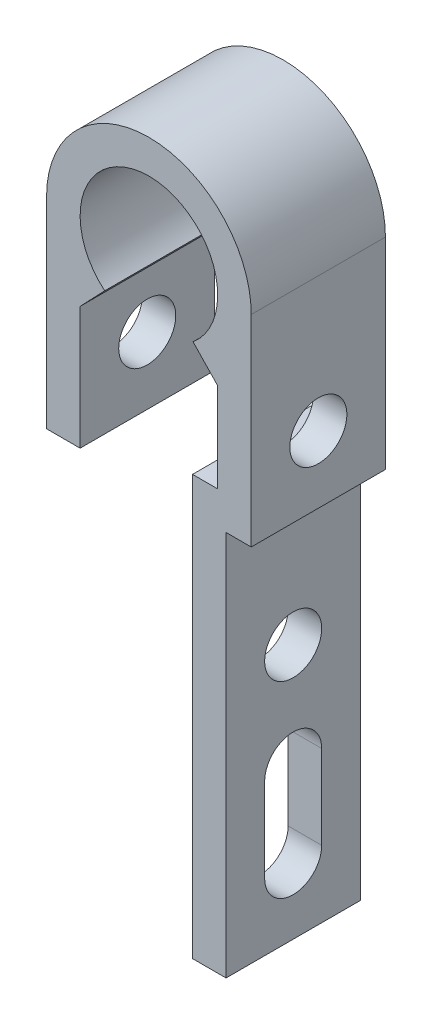
ISO-10303-21;
HEADER;
FILE_DESCRIPTION(('STEP AP214'),'2;1');
FILE_NAME('part.step','',(''),(''),'','','');
FILE_SCHEMA(('AUTOMOTIVE_DESIGN { 1 0 10303 214 1 1 1 1 }'));
ENDSEC;
DATA;
#1=APPLICATION_CONTEXT('core data for automotive mechanical design processes');
#2=APPLICATION_PROTOCOL_DEFINITION('international standard','automotive_design',2000,#1);
#3=PRODUCT_CONTEXT('',#1,'mechanical');
#4=PRODUCT('Part','Part','',(#3));
#5=PRODUCT_RELATED_PRODUCT_CATEGORY('part','',(#4));
#6=PRODUCT_DEFINITION_FORMATION('','',#4);
#7=PRODUCT_DEFINITION_CONTEXT('part definition',#1,'design');
#8=PRODUCT_DEFINITION('design','',#6,#7);
#9=PRODUCT_DEFINITION_SHAPE('','',#8);
#10=(LENGTH_UNIT() NAMED_UNIT(*) SI_UNIT(.MILLI.,.METRE.));
#11=(NAMED_UNIT(*) PLANE_ANGLE_UNIT() SI_UNIT($,.RADIAN.));
#12=(NAMED_UNIT(*) SI_UNIT($,.STERADIAN.) SOLID_ANGLE_UNIT());
#13=UNCERTAINTY_MEASURE_WITH_UNIT(LENGTH_MEASURE(1.E-05),#10,'distance_accuracy_value','');
#14=(GEOMETRIC_REPRESENTATION_CONTEXT(3) GLOBAL_UNCERTAINTY_ASSIGNED_CONTEXT((#13)) GLOBAL_UNIT_ASSIGNED_CONTEXT((#10,
#11,#12)) REPRESENTATION_CONTEXT('',''));
#15=CARTESIAN_POINT('',(0.,0.,0.));
#16=DIRECTION('',(0.,0.,1.));
#17=DIRECTION('',(1.,0.,0.));
#18=AXIS2_PLACEMENT_3D('',#15,#16,#17);
#19=CARTESIAN_POINT('',(-4.1,-12.,8.));
#20=DIRECTION('',(-1.,0.,0.));
#21=DIRECTION('',(0.,0.,1.));
#22=AXIS2_PLACEMENT_3D('',#19,#20,#21);
#23=PLANE('',#22);
#24=CARTESIAN_POINT('',(-4.1,-8.,4.));
#25=DIRECTION('',(-1.,0.,0.));
#26=DIRECTION('',(0.,0.,1.));
#27=AXIS2_PLACEMENT_3D('',#24,#25,#26);
#28=CIRCLE('',#27,1.7);
#29=CARTESIAN_POINT('',(-4.1,-8.,5.7));
#30=VERTEX_POINT('',#29);
#31=EDGE_CURVE('E250',#30,#30,#28,.T.);
#32=ORIENTED_EDGE('',*,*,#31,.T.);
#33=EDGE_LOOP('',(#32));
#34=FACE_BOUND('',#33,.T.);
#35=DIRECTION('',(0.,1.,0.));
#36=VECTOR('',#35,1.);
#37=CARTESIAN_POINT('',(-4.1,-12.,0.));
#38=LINE('',#37,#36);
#39=CARTESIAN_POINT('',(-4.1,-12.,0.));
#40=VERTEX_POINT('',#39);
#41=CARTESIAN_POINT('',(-4.1,-4.67694508196814,0.));
#42=VERTEX_POINT('',#41);
#43=EDGE_CURVE('E247',#40,#42,#38,.T.);
#44=ORIENTED_EDGE('',*,*,#43,.T.);
#45=DIRECTION('',(0.,0.,-1.));
#46=VECTOR('',#45,1.);
#47=CARTESIAN_POINT('',(-4.1,-4.67694508196814,8.));
#48=LINE('',#47,#46);
#49=CARTESIAN_POINT('',(-4.1,-4.67694508196814,8.));
#50=VERTEX_POINT('',#49);
#51=EDGE_CURVE('E159',#50,#42,#48,.T.);
#52=ORIENTED_EDGE('',*,*,#51,.F.);
#53=DIRECTION('',(0.,1.,0.));
#54=VECTOR('',#53,1.);
#55=CARTESIAN_POINT('',(-4.1,-12.,8.));
#56=LINE('',#55,#54);
#57=CARTESIAN_POINT('',(-4.1,-12.,8.));
#58=VERTEX_POINT('',#57);
#59=EDGE_CURVE('E222',#58,#50,#56,.T.);
#60=ORIENTED_EDGE('',*,*,#59,.F.);
#61=DIRECTION('',(0.,0.,-1.));
#62=VECTOR('',#61,1.);
#63=CARTESIAN_POINT('',(-4.1,-12.,8.));
#64=LINE('',#63,#62);
#65=EDGE_CURVE('E216',#58,#40,#64,.T.);
#66=ORIENTED_EDGE('',*,*,#65,.T.);
#67=EDGE_LOOP('',(#44,#52,#60,#66));
#68=FACE_BOUND('',#67,.T.);
#69=ADVANCED_FACE('F32',(#34,#68),#23,.F.);
#70=CARTESIAN_POINT('',(-2.63542919971482,-3.14078221678781,8.));
#71=DIRECTION('',(-0.723771106305428,0.690040133381687,0.));
#72=DIRECTION('',(-0.690040133381687,-0.723771106305428,0.));
#73=AXIS2_PLACEMENT_3D('',#70,#71,#72);
#74=PLANE('',#73);
#75=DIRECTION('',(0.690040133381687,0.723771106305428,0.));
#76=VECTOR('',#75,1.);
#77=CARTESIAN_POINT('',(-2.63542919971482,-3.14078221678781,0.));
#78=LINE('',#77,#76);
#79=CARTESIAN_POINT('',(-2.63542919971481,-3.14078221678781,0.));
#80=VERTEX_POINT('',#79);
#81=EDGE_CURVE('E245',#42,#80,#78,.T.);
#82=ORIENTED_EDGE('',*,*,#81,.T.);
#83=DIRECTION('',(0.,0.,-1.));
#84=VECTOR('',#83,1.);
#85=CARTESIAN_POINT('',(-2.63542919971481,-3.14078221678781,8.));
#86=LINE('',#85,#84);
#87=CARTESIAN_POINT('',(-2.63542919971481,-3.14078221678781,8.));
#88=VERTEX_POINT('',#87);
#89=EDGE_CURVE('E180',#88,#80,#86,.T.);
#90=ORIENTED_EDGE('',*,*,#89,.F.);
#91=DIRECTION('',(0.690040133381687,0.723771106305428,0.));
#92=VECTOR('',#91,1.);
#93=CARTESIAN_POINT('',(-2.63542919971482,-3.14078221678781,8.));
#94=LINE('',#93,#92);
#95=EDGE_CURVE('E274',#50,#88,#94,.T.);
#96=ORIENTED_EDGE('',*,*,#95,.F.);
#97=ORIENTED_EDGE('',*,*,#51,.T.);
#98=EDGE_LOOP('',(#82,#90,#96,#97));
#99=FACE_BOUND('',#98,.T.);
#100=ADVANCED_FACE('F322',(#99),#74,.F.);
#101=CARTESIAN_POINT('',(0.,0.,8.));
#102=DIRECTION('',(0.,0.,-1.));
#103=DIRECTION('',(-1.,0.,0.));
#104=AXIS2_PLACEMENT_3D('',#101,#102,#103);
#105=CYLINDRICAL_SURFACE('',#104,4.1);
#106=CARTESIAN_POINT('',(0.,0.,0.));
#107=DIRECTION('',(0.,0.,-1.));
#108=DIRECTION('',(-1.,0.,0.));
#109=AXIS2_PLACEMENT_3D('',#106,#107,#108);
#110=CIRCLE('',#109,4.1);
#111=CARTESIAN_POINT('',(2.63542919971482,-3.14078221678781,0.));
#112=VERTEX_POINT('',#111);
#113=EDGE_CURVE('E243',#80,#112,#110,.T.);
#114=ORIENTED_EDGE('',*,*,#113,.T.);
#115=DIRECTION('',(0.,0.,-1.));
#116=VECTOR('',#115,1.);
#117=CARTESIAN_POINT('',(2.63542919971482,-3.14078221678781,8.));
#118=LINE('',#117,#116);
#119=CARTESIAN_POINT('',(2.63542919971482,-3.14078221678781,8.));
#120=VERTEX_POINT('',#119);
#121=EDGE_CURVE('E183',#120,#112,#118,.T.);
#122=ORIENTED_EDGE('',*,*,#121,.F.);
#123=CARTESIAN_POINT('',(0.,0.,8.));
#124=DIRECTION('',(0.,0.,-1.));
#125=DIRECTION('',(-1.,0.,0.));
#126=AXIS2_PLACEMENT_3D('',#123,#124,#125);
#127=CIRCLE('',#126,4.1);
#128=EDGE_CURVE('E272',#88,#120,#127,.T.);
#129=ORIENTED_EDGE('',*,*,#128,.F.);
#130=ORIENTED_EDGE('',*,*,#89,.T.);
#131=EDGE_LOOP('',(#114,#122,#129,#130));
#132=FACE_BOUND('',#131,.T.);
#133=ADVANCED_FACE('F327',(#132),#105,.F.);
#134=CARTESIAN_POINT('',(4.1,-4.67694508196814,8.));
#135=DIRECTION('',(0.723771106305428,0.690040133381687,0.));
#136=DIRECTION('',(-0.690040133381688,0.723771106305428,0.));
#137=AXIS2_PLACEMENT_3D('',#134,#135,#136);
#138=PLANE('',#137);
#139=DIRECTION('',(0.690040133381687,-0.723771106305428,0.));
#140=VECTOR('',#139,1.);
#141=CARTESIAN_POINT('',(4.1,-4.67694508196814,0.));
#142=LINE('',#141,#140);
#143=CARTESIAN_POINT('',(4.1,-4.67694508196814,0.));
#144=VERTEX_POINT('',#143);
#145=EDGE_CURVE('E241',#112,#144,#142,.T.);
#146=ORIENTED_EDGE('',*,*,#145,.T.);
#147=DIRECTION('',(0.,0.,-1.));
#148=VECTOR('',#147,1.);
#149=CARTESIAN_POINT('',(4.1,-4.67694508196814,8.));
#150=LINE('',#149,#148);
#151=CARTESIAN_POINT('',(4.1,-4.67694508196814,8.));
#152=VERTEX_POINT('',#151);
#153=EDGE_CURVE('E186',#152,#144,#150,.T.);
#154=ORIENTED_EDGE('',*,*,#153,.F.);
#155=DIRECTION('',(0.690040133381687,-0.723771106305428,0.));
#156=VECTOR('',#155,1.);
#157=CARTESIAN_POINT('',(4.1,-4.67694508196814,8.));
#158=LINE('',#157,#156);
#159=EDGE_CURVE('E270',#120,#152,#158,.T.);
#160=ORIENTED_EDGE('',*,*,#159,.F.);
#161=ORIENTED_EDGE('',*,*,#121,.T.);
#162=EDGE_LOOP('',(#146,#154,#160,#161));
#163=FACE_BOUND('',#162,.T.);
#164=ADVANCED_FACE('F391',(#163),#138,.F.);
#165=CARTESIAN_POINT('',(4.1,-4.67694508196814,8.));
#166=DIRECTION('',(1.,0.,0.));
#167=DIRECTION('',(0.,1.,0.));
#168=AXIS2_PLACEMENT_3D('',#165,#166,#167);
#169=PLANE('',#168);
#170=CARTESIAN_POINT('',(4.1,-8.,4.));
#171=DIRECTION('',(1.,0.,0.));
#172=DIRECTION('',(0.,1.,0.));
#173=AXIS2_PLACEMENT_3D('',#170,#171,#172);
#174=CIRCLE('',#173,1.7);
#175=CARTESIAN_POINT('',(4.1,-6.3,4.));
#176=VERTEX_POINT('',#175);
#177=EDGE_CURVE('E280',#176,#176,#174,.T.);
#178=ORIENTED_EDGE('',*,*,#177,.T.);
#179=EDGE_LOOP('',(#178));
#180=FACE_BOUND('',#179,.T.);
#181=DIRECTION('',(0.,-1.,0.));
#182=VECTOR('',#181,1.);
#183=CARTESIAN_POINT('',(4.1,-4.67694508196814,0.));
#184=LINE('',#183,#182);
#185=CARTESIAN_POINT('',(4.1,-10.,0.));
#186=VERTEX_POINT('',#185);
#187=EDGE_CURVE('E239',#144,#186,#184,.T.);
#188=ORIENTED_EDGE('',*,*,#187,.T.);
#189=DIRECTION('',(0.,0.,-1.));
#190=VECTOR('',#189,1.);
#191=CARTESIAN_POINT('',(4.1,-10.,8.));
#192=LINE('',#191,#190);
#193=CARTESIAN_POINT('',(4.1,-10.,8.));
#194=VERTEX_POINT('',#193);
#195=EDGE_CURVE('E189',#194,#186,#192,.T.);
#196=ORIENTED_EDGE('',*,*,#195,.F.);
#197=DIRECTION('',(0.,-1.,0.));
#198=VECTOR('',#197,1.);
#199=CARTESIAN_POINT('',(4.1,-4.67694508196814,8.));
#200=LINE('',#199,#198);
#201=EDGE_CURVE('E268',#152,#194,#200,.T.);
#202=ORIENTED_EDGE('',*,*,#201,.F.);
#203=ORIENTED_EDGE('',*,*,#153,.T.);
#204=EDGE_LOOP('',(#188,#196,#202,#203));
#205=FACE_BOUND('',#204,.T.);
#206=ADVANCED_FACE('F387',(#180,#205),#169,.F.);
#207=CARTESIAN_POINT('',(4.1,-10.,8.));
#208=DIRECTION('',(0.,-1.,0.));
#209=DIRECTION('',(0.,0.,-1.));
#210=AXIS2_PLACEMENT_3D('',#207,#208,#209);
#211=PLANE('',#210);
#212=DIRECTION('',(-1.,0.,0.));
#213=VECTOR('',#212,1.);
#214=CARTESIAN_POINT('',(4.1,-10.,0.));
#215=LINE('',#214,#213);
#216=CARTESIAN_POINT('',(2.6,-10.,0.));
#217=VERTEX_POINT('',#216);
#218=EDGE_CURVE('E237',#186,#217,#215,.T.);
#219=ORIENTED_EDGE('',*,*,#218,.T.);
#220=DIRECTION('',(0.,0.,-1.));
#221=VECTOR('',#220,1.);
#222=CARTESIAN_POINT('',(2.6,-10.,8.));
#223=LINE('',#222,#221);
#224=CARTESIAN_POINT('',(2.6,-10.,8.));
#225=VERTEX_POINT('',#224);
#226=EDGE_CURVE('E192',#225,#217,#223,.T.);
#227=ORIENTED_EDGE('',*,*,#226,.F.);
#228=DIRECTION('',(-1.,0.,0.));
#229=VECTOR('',#228,1.);
#230=CARTESIAN_POINT('',(4.1,-10.,8.));
#231=LINE('',#230,#229);
#232=EDGE_CURVE('E266',#194,#225,#231,.T.);
#233=ORIENTED_EDGE('',*,*,#232,.F.);
#234=ORIENTED_EDGE('',*,*,#195,.T.);
#235=EDGE_LOOP('',(#219,#227,#233,#234));
#236=FACE_BOUND('',#235,.T.);
#237=ADVANCED_FACE('F382',(#236),#211,.F.);
#238=CARTESIAN_POINT('',(2.6,-10.,8.));
#239=DIRECTION('',(1.,0.,0.));
#240=DIRECTION('',(0.,1.,0.));
#241=AXIS2_PLACEMENT_3D('',#238,#239,#240);
#242=PLANE('',#241);
#243=CARTESIAN_POINT('',(2.6,-19.8,4.));
#244=DIRECTION('',(1.,0.,0.));
#245=DIRECTION('',(0.,1.,0.));
#246=AXIS2_PLACEMENT_3D('',#243,#244,#245);
#247=CIRCLE('',#246,1.7);
#248=CARTESIAN_POINT('',(2.6,-18.1,4.));
#249=VERTEX_POINT('',#248);
#250=EDGE_CURVE('E287',#249,#249,#247,.T.);
#251=ORIENTED_EDGE('',*,*,#250,.T.);
#252=EDGE_LOOP('',(#251));
#253=FACE_BOUND('',#252,.T.);
#254=DIRECTION('',(0.,1.,0.));
#255=VECTOR('',#254,1.);
#256=CARTESIAN_POINT('',(2.6,-10.,2.3));
#257=LINE('',#256,#255);
#258=CARTESIAN_POINT('',(2.6,-31.,2.3));
#259=VERTEX_POINT('',#258);
#260=CARTESIAN_POINT('',(2.6,-26.,2.3));
#261=VERTEX_POINT('',#260);
#262=EDGE_CURVE('E299',#259,#261,#257,.T.);
#263=ORIENTED_EDGE('',*,*,#262,.T.);
#264=CARTESIAN_POINT('',(2.6,-26.,4.));
#265=DIRECTION('',(1.,0.,0.));
#266=DIRECTION('',(0.,1.,0.));
#267=AXIS2_PLACEMENT_3D('',#264,#265,#266);
#268=CIRCLE('',#267,1.7);
#269=CARTESIAN_POINT('',(2.6,-26.,5.7));
#270=VERTEX_POINT('',#269);
#271=EDGE_CURVE('E166',#261,#270,#268,.T.);
#272=ORIENTED_EDGE('',*,*,#271,.T.);
#273=DIRECTION('',(0.,-1.,0.));
#274=VECTOR('',#273,1.);
#275=CARTESIAN_POINT('',(2.6,-10.,5.69999999999999));
#276=LINE('',#275,#274);
#277=CARTESIAN_POINT('',(2.6,-31.,5.7));
#278=VERTEX_POINT('',#277);
#279=EDGE_CURVE('E293',#270,#278,#276,.T.);
#280=ORIENTED_EDGE('',*,*,#279,.T.);
#281=CARTESIAN_POINT('',(2.6,-31.,4.));
#282=DIRECTION('',(1.,0.,0.));
#283=DIRECTION('',(0.,1.,0.));
#284=AXIS2_PLACEMENT_3D('',#281,#282,#283);
#285=CIRCLE('',#284,1.7);
#286=EDGE_CURVE('E296',#278,#259,#285,.T.);
#287=ORIENTED_EDGE('',*,*,#286,.T.);
#288=EDGE_LOOP('',(#263,#272,#280,#287));
#289=FACE_BOUND('',#288,.T.);
#290=DIRECTION('',(0.,-1.,0.));
#291=VECTOR('',#290,1.);
#292=CARTESIAN_POINT('',(2.6,-10.,0.));
#293=LINE('',#292,#291);
#294=CARTESIAN_POINT('',(2.6,-35.,0.));
#295=VERTEX_POINT('',#294);
#296=EDGE_CURVE('E235',#217,#295,#293,.T.);
#297=ORIENTED_EDGE('',*,*,#296,.T.);
#298=DIRECTION('',(0.,0.,-1.));
#299=VECTOR('',#298,1.);
#300=CARTESIAN_POINT('',(2.6,-35.,8.));
#301=LINE('',#300,#299);
#302=CARTESIAN_POINT('',(2.6,-35.,8.));
#303=VERTEX_POINT('',#302);
#304=EDGE_CURVE('E195',#303,#295,#301,.T.);
#305=ORIENTED_EDGE('',*,*,#304,.F.);
#306=DIRECTION('',(0.,-1.,0.));
#307=VECTOR('',#306,1.);
#308=CARTESIAN_POINT('',(2.6,-10.,8.));
#309=LINE('',#308,#307);
#310=EDGE_CURVE('E264',#225,#303,#309,.T.);
#311=ORIENTED_EDGE('',*,*,#310,.F.);
#312=ORIENTED_EDGE('',*,*,#226,.T.);
#313=EDGE_LOOP('',(#297,#305,#311,#312));
#314=FACE_BOUND('',#313,.T.);
#315=ADVANCED_FACE('F306',(#253,#289,#314),#242,.F.);
#316=CARTESIAN_POINT('',(2.6,-35.,8.));
#317=DIRECTION('',(0.,1.,0.));
#318=DIRECTION('',(0.,0.,1.));
#319=AXIS2_PLACEMENT_3D('',#316,#317,#318);
#320=PLANE('',#319);
#321=DIRECTION('',(1.,0.,0.));
#322=VECTOR('',#321,1.);
#323=CARTESIAN_POINT('',(2.6,-35.,0.));
#324=LINE('',#323,#322);
#325=CARTESIAN_POINT('',(4.6,-35.,0.));
#326=VERTEX_POINT('',#325);
#327=EDGE_CURVE('E233',#295,#326,#324,.T.);
#328=ORIENTED_EDGE('',*,*,#327,.T.);
#329=DIRECTION('',(0.,0.,-1.));
#330=VECTOR('',#329,1.);
#331=CARTESIAN_POINT('',(4.6,-35.,8.));
#332=LINE('',#331,#330);
#333=CARTESIAN_POINT('',(4.6,-35.,8.));
#334=VERTEX_POINT('',#333);
#335=EDGE_CURVE('E198',#334,#326,#332,.T.);
#336=ORIENTED_EDGE('',*,*,#335,.F.);
#337=DIRECTION('',(1.,0.,0.));
#338=VECTOR('',#337,1.);
#339=CARTESIAN_POINT('',(2.6,-35.,8.));
#340=LINE('',#339,#338);
#341=EDGE_CURVE('E262',#303,#334,#340,.T.);
#342=ORIENTED_EDGE('',*,*,#341,.F.);
#343=ORIENTED_EDGE('',*,*,#304,.T.);
#344=EDGE_LOOP('',(#328,#336,#342,#343));
#345=FACE_BOUND('',#344,.T.);
#346=ADVANCED_FACE('F375',(#345),#320,.F.);
#347=CARTESIAN_POINT('',(4.6,-12.,8.));
#348=DIRECTION('',(-1.,0.,0.));
#349=DIRECTION('',(0.,-1.,0.));
#350=AXIS2_PLACEMENT_3D('',#347,#348,#349);
#351=PLANE('',#350);
#352=CARTESIAN_POINT('',(4.6,-19.8,4.));
#353=DIRECTION('',(-1.,0.,0.));
#354=DIRECTION('',(0.,-1.,0.));
#355=AXIS2_PLACEMENT_3D('',#352,#353,#354);
#356=CIRCLE('',#355,1.7);
#357=CARTESIAN_POINT('',(4.6,-21.5,4.));
#358=VERTEX_POINT('',#357);
#359=EDGE_CURVE('E35',#358,#358,#356,.T.);
#360=ORIENTED_EDGE('',*,*,#359,.T.);
#361=EDGE_LOOP('',(#360));
#362=FACE_BOUND('',#361,.T.);
#363=DIRECTION('',(0.,1.,0.));
#364=VECTOR('',#363,1.);
#365=CARTESIAN_POINT('',(4.6,-12.,5.69999999999999));
#366=LINE('',#365,#364);
#367=CARTESIAN_POINT('',(4.6,-31.,5.7));
#368=VERTEX_POINT('',#367);
#369=CARTESIAN_POINT('',(4.6,-26.,5.7));
#370=VERTEX_POINT('',#369);
#371=EDGE_CURVE('E40',#368,#370,#366,.T.);
#372=ORIENTED_EDGE('',*,*,#371,.T.);
#373=CARTESIAN_POINT('',(4.6,-26.,4.));
#374=DIRECTION('',(-1.,0.,0.));
#375=DIRECTION('',(0.,-1.,0.));
#376=AXIS2_PLACEMENT_3D('',#373,#374,#375);
#377=CIRCLE('',#376,1.7);
#378=CARTESIAN_POINT('',(4.6,-26.,2.3));
#379=VERTEX_POINT('',#378);
#380=EDGE_CURVE('E11',#370,#379,#377,.T.);
#381=ORIENTED_EDGE('',*,*,#380,.T.);
#382=DIRECTION('',(0.,-1.,0.));
#383=VECTOR('',#382,1.);
#384=CARTESIAN_POINT('',(4.6,-12.,2.3));
#385=LINE('',#384,#383);
#386=CARTESIAN_POINT('',(4.6,-31.,2.3));
#387=VERTEX_POINT('',#386);
#388=EDGE_CURVE('E154',#379,#387,#385,.T.);
#389=ORIENTED_EDGE('',*,*,#388,.T.);
#390=CARTESIAN_POINT('',(4.6,-31.,4.));
#391=DIRECTION('',(-1.,0.,0.));
#392=DIRECTION('',(0.,-1.,0.));
#393=AXIS2_PLACEMENT_3D('',#390,#391,#392);
#394=CIRCLE('',#393,1.7);
#395=EDGE_CURVE('E158',#387,#368,#394,.T.);
#396=ORIENTED_EDGE('',*,*,#395,.T.);
#397=EDGE_LOOP('',(#372,#381,#389,#396));
#398=FACE_BOUND('',#397,.T.);
#399=DIRECTION('',(0.,1.,0.));
#400=VECTOR('',#399,1.);
#401=CARTESIAN_POINT('',(4.6,-12.,0.));
#402=LINE('',#401,#400);
#403=CARTESIAN_POINT('',(4.6,-12.,0.));
#404=VERTEX_POINT('',#403);
#405=EDGE_CURVE('E231',#326,#404,#402,.T.);
#406=ORIENTED_EDGE('',*,*,#405,.T.);
#407=DIRECTION('',(0.,0.,-1.));
#408=VECTOR('',#407,1.);
#409=CARTESIAN_POINT('',(4.6,-12.,8.));
#410=LINE('',#409,#408);
#411=CARTESIAN_POINT('',(4.6,-12.,8.));
#412=VERTEX_POINT('',#411);
#413=EDGE_CURVE('E201',#412,#404,#410,.T.);
#414=ORIENTED_EDGE('',*,*,#413,.F.);
#415=DIRECTION('',(0.,1.,0.));
#416=VECTOR('',#415,1.);
#417=CARTESIAN_POINT('',(4.6,-12.,8.));
#418=LINE('',#417,#416);
#419=EDGE_CURVE('E260',#334,#412,#418,.T.);
#420=ORIENTED_EDGE('',*,*,#419,.F.);
#421=ORIENTED_EDGE('',*,*,#335,.T.);
#422=EDGE_LOOP('',(#406,#414,#420,#421));
#423=FACE_BOUND('',#422,.T.);
#424=ADVANCED_FACE('F170',(#362,#398,#423),#351,.F.);
#425=CARTESIAN_POINT('',(6.1,-12.,8.));
#426=DIRECTION('',(0.,1.,0.));
#427=DIRECTION('',(0.,0.,1.));
#428=AXIS2_PLACEMENT_3D('',#425,#426,#427);
#429=PLANE('',#428);
#430=DIRECTION('',(1.,0.,0.));
#431=VECTOR('',#430,1.);
#432=CARTESIAN_POINT('',(6.1,-12.,0.));
#433=LINE('',#432,#431);
#434=CARTESIAN_POINT('',(6.1,-12.,0.));
#435=VERTEX_POINT('',#434);
#436=EDGE_CURVE('E229',#404,#435,#433,.T.);
#437=ORIENTED_EDGE('',*,*,#436,.T.);
#438=DIRECTION('',(0.,0.,-1.));
#439=VECTOR('',#438,1.);
#440=CARTESIAN_POINT('',(6.1,-12.,8.));
#441=LINE('',#440,#439);
#442=CARTESIAN_POINT('',(6.1,-12.,8.));
#443=VERTEX_POINT('',#442);
#444=EDGE_CURVE('E204',#443,#435,#441,.T.);
#445=ORIENTED_EDGE('',*,*,#444,.F.);
#446=DIRECTION('',(1.,0.,0.));
#447=VECTOR('',#446,1.);
#448=CARTESIAN_POINT('',(6.1,-12.,8.));
#449=LINE('',#448,#447);
#450=EDGE_CURVE('E258',#412,#443,#449,.T.);
#451=ORIENTED_EDGE('',*,*,#450,.F.);
#452=ORIENTED_EDGE('',*,*,#413,.T.);
#453=EDGE_LOOP('',(#437,#445,#451,#452));
#454=FACE_BOUND('',#453,.T.);
#455=ADVANCED_FACE('F366',(#454),#429,.F.);
#456=CARTESIAN_POINT('',(6.1,0.,8.));
#457=DIRECTION('',(-1.,0.,0.));
#458=DIRECTION('',(0.,0.,1.));
#459=AXIS2_PLACEMENT_3D('',#456,#457,#458);
#460=PLANE('',#459);
#461=CARTESIAN_POINT('',(6.1,-8.,4.));
#462=DIRECTION('',(-1.,0.,0.));
#463=DIRECTION('',(0.,0.,1.));
#464=AXIS2_PLACEMENT_3D('',#461,#462,#463);
#465=CIRCLE('',#464,1.7);
#466=CARTESIAN_POINT('',(6.1,-8.,5.7));
#467=VERTEX_POINT('',#466);
#468=EDGE_CURVE('E283',#467,#467,#465,.T.);
#469=ORIENTED_EDGE('',*,*,#468,.T.);
#470=EDGE_LOOP('',(#469));
#471=FACE_BOUND('',#470,.T.);
#472=DIRECTION('',(0.,1.,0.));
#473=VECTOR('',#472,1.);
#474=CARTESIAN_POINT('',(6.1,0.,0.));
#475=LINE('',#474,#473);
#476=CARTESIAN_POINT('',(6.1,0.,0.));
#477=VERTEX_POINT('',#476);
#478=EDGE_CURVE('E227',#435,#477,#475,.T.);
#479=ORIENTED_EDGE('',*,*,#478,.T.);
#480=DIRECTION('',(0.,0.,-1.));
#481=VECTOR('',#480,1.);
#482=CARTESIAN_POINT('',(6.1,0.,8.));
#483=LINE('',#482,#481);
#484=CARTESIAN_POINT('',(6.1,0.,8.));
#485=VERTEX_POINT('',#484);
#486=EDGE_CURVE('E207',#485,#477,#483,.T.);
#487=ORIENTED_EDGE('',*,*,#486,.F.);
#488=DIRECTION('',(0.,1.,0.));
#489=VECTOR('',#488,1.);
#490=CARTESIAN_POINT('',(6.1,0.,8.));
#491=LINE('',#490,#489);
#492=EDGE_CURVE('E256',#443,#485,#491,.T.);
#493=ORIENTED_EDGE('',*,*,#492,.F.);
#494=ORIENTED_EDGE('',*,*,#444,.T.);
#495=EDGE_LOOP('',(#479,#487,#493,#494));
#496=FACE_BOUND('',#495,.T.);
#497=ADVANCED_FACE('F362',(#471,#496),#460,.F.);
#498=CARTESIAN_POINT('',(0.,0.,8.));
#499=DIRECTION('',(0.,0.,-1.));
#500=DIRECTION('',(-1.,0.,0.));
#501=AXIS2_PLACEMENT_3D('',#498,#499,#500);
#502=CYLINDRICAL_SURFACE('',#501,6.1);
#503=CARTESIAN_POINT('',(0.,0.,0.));
#504=DIRECTION('',(0.,0.,1.));
#505=DIRECTION('',(-1.,0.,0.));
#506=AXIS2_PLACEMENT_3D('',#503,#504,#505);
#507=CIRCLE('',#506,6.1);
#508=CARTESIAN_POINT('',(-6.1,0.,0.));
#509=VERTEX_POINT('',#508);
#510=EDGE_CURVE('E225',#477,#509,#507,.T.);
#511=ORIENTED_EDGE('',*,*,#510,.T.);
#512=DIRECTION('',(0.,0.,-1.));
#513=VECTOR('',#512,1.);
#514=CARTESIAN_POINT('',(-6.1,0.,8.));
#515=LINE('',#514,#513);
#516=CARTESIAN_POINT('',(-6.1,0.,8.));
#517=VERTEX_POINT('',#516);
#518=EDGE_CURVE('E210',#517,#509,#515,.T.);
#519=ORIENTED_EDGE('',*,*,#518,.F.);
#520=CARTESIAN_POINT('',(0.,0.,8.));
#521=DIRECTION('',(0.,0.,1.));
#522=DIRECTION('',(-1.,0.,0.));
#523=AXIS2_PLACEMENT_3D('',#520,#521,#522);
#524=CIRCLE('',#523,6.1);
#525=EDGE_CURVE('E254',#485,#517,#524,.T.);
#526=ORIENTED_EDGE('',*,*,#525,.F.);
#527=ORIENTED_EDGE('',*,*,#486,.T.);
#528=EDGE_LOOP('',(#511,#519,#526,#527));
#529=FACE_BOUND('',#528,.T.);
#530=ADVANCED_FACE('F357',(#529),#502,.T.);
#531=CARTESIAN_POINT('',(-6.1,-12.,8.));
#532=DIRECTION('',(1.,0.,0.));
#533=DIRECTION('',(0.,1.,0.));
#534=AXIS2_PLACEMENT_3D('',#531,#532,#533);
#535=PLANE('',#534);
#536=CARTESIAN_POINT('',(-6.1,-8.,4.));
#537=DIRECTION('',(-1.,0.,0.));
#538=DIRECTION('',(0.,0.,1.));
#539=AXIS2_PLACEMENT_3D('',#536,#537,#538);
#540=CIRCLE('',#539,1.7);
#541=CARTESIAN_POINT('',(-6.1,-8.,5.7));
#542=VERTEX_POINT('',#541);
#543=EDGE_CURVE('E284',#542,#542,#540,.T.);
#544=ORIENTED_EDGE('',*,*,#543,.F.);
#545=EDGE_LOOP('',(#544));
#546=FACE_BOUND('',#545,.T.);
#547=DIRECTION('',(0.,-1.,0.));
#548=VECTOR('',#547,1.);
#549=CARTESIAN_POINT('',(-6.1,-12.,0.));
#550=LINE('',#549,#548);
#551=CARTESIAN_POINT('',(-6.1,-12.,0.));
#552=VERTEX_POINT('',#551);
#553=EDGE_CURVE('E223',#509,#552,#550,.T.);
#554=ORIENTED_EDGE('',*,*,#553,.T.);
#555=DIRECTION('',(0.,0.,-1.));
#556=VECTOR('',#555,1.);
#557=CARTESIAN_POINT('',(-6.1,-12.,8.));
#558=LINE('',#557,#556);
#559=CARTESIAN_POINT('',(-6.1,-12.,8.));
#560=VERTEX_POINT('',#559);
#561=EDGE_CURVE('E213',#560,#552,#558,.T.);
#562=ORIENTED_EDGE('',*,*,#561,.F.);
#563=DIRECTION('',(0.,-1.,0.));
#564=VECTOR('',#563,1.);
#565=CARTESIAN_POINT('',(-6.1,-12.,8.));
#566=LINE('',#565,#564);
#567=EDGE_CURVE('E252',#517,#560,#566,.T.);
#568=ORIENTED_EDGE('',*,*,#567,.F.);
#569=ORIENTED_EDGE('',*,*,#518,.T.);
#570=EDGE_LOOP('',(#554,#562,#568,#569));
#571=FACE_BOUND('',#570,.T.);
#572=ADVANCED_FACE('F351',(#546,#571),#535,.F.);
#573=CARTESIAN_POINT('',(-6.1,-12.,8.));
#574=DIRECTION('',(0.,1.,0.));
#575=DIRECTION('',(0.,0.,1.));
#576=AXIS2_PLACEMENT_3D('',#573,#574,#575);
#577=PLANE('',#576);
#578=DIRECTION('',(1.,0.,0.));
#579=VECTOR('',#578,1.);
#580=CARTESIAN_POINT('',(-6.1,-12.,0.));
#581=LINE('',#580,#579);
#582=EDGE_CURVE('E220',#552,#40,#581,.T.);
#583=ORIENTED_EDGE('',*,*,#582,.T.);
#584=ORIENTED_EDGE('',*,*,#65,.F.);
#585=DIRECTION('',(1.,0.,0.));
#586=VECTOR('',#585,1.);
#587=CARTESIAN_POINT('',(-6.1,-12.,8.));
#588=LINE('',#587,#586);
#589=EDGE_CURVE('E219',#560,#58,#588,.T.);
#590=ORIENTED_EDGE('',*,*,#589,.F.);
#591=ORIENTED_EDGE('',*,*,#561,.T.);
#592=EDGE_LOOP('',(#583,#584,#590,#591));
#593=FACE_BOUND('',#592,.T.);
#594=ADVANCED_FACE('F349',(#593),#577,.F.);
#595=CARTESIAN_POINT('',(0.,0.,8.));
#596=DIRECTION('',(0.,0.,-1.));
#597=DIRECTION('',(-1.,0.,0.));
#598=AXIS2_PLACEMENT_3D('',#595,#596,#597);
#599=PLANE('',#598);
#600=ORIENTED_EDGE('',*,*,#59,.T.);
#601=ORIENTED_EDGE('',*,*,#95,.T.);
#602=ORIENTED_EDGE('',*,*,#128,.T.);
#603=ORIENTED_EDGE('',*,*,#159,.T.);
#604=ORIENTED_EDGE('',*,*,#201,.T.);
#605=ORIENTED_EDGE('',*,*,#232,.T.);
#606=ORIENTED_EDGE('',*,*,#310,.T.);
#607=ORIENTED_EDGE('',*,*,#341,.T.);
#608=ORIENTED_EDGE('',*,*,#419,.T.);
#609=ORIENTED_EDGE('',*,*,#450,.T.);
#610=ORIENTED_EDGE('',*,*,#492,.T.);
#611=ORIENTED_EDGE('',*,*,#525,.T.);
#612=ORIENTED_EDGE('',*,*,#567,.T.);
#613=ORIENTED_EDGE('',*,*,#589,.T.);
#614=EDGE_LOOP('',(#600,#601,#602,#603,#604,#605,#606,#607,#608,#609,#610,#611,#612,#613));
#615=FACE_BOUND('',#614,.T.);
#616=ADVANCED_FACE('F344',(#615),#599,.F.);
#617=CARTESIAN_POINT('',(0.,0.,0.));
#618=DIRECTION('',(0.,0.,-1.));
#619=DIRECTION('',(-1.,0.,0.));
#620=AXIS2_PLACEMENT_3D('',#617,#618,#619);
#621=PLANE('',#620);
#622=ORIENTED_EDGE('',*,*,#43,.F.);
#623=ORIENTED_EDGE('',*,*,#582,.F.);
#624=ORIENTED_EDGE('',*,*,#553,.F.);
#625=ORIENTED_EDGE('',*,*,#510,.F.);
#626=ORIENTED_EDGE('',*,*,#478,.F.);
#627=ORIENTED_EDGE('',*,*,#436,.F.);
#628=ORIENTED_EDGE('',*,*,#405,.F.);
#629=ORIENTED_EDGE('',*,*,#327,.F.);
#630=ORIENTED_EDGE('',*,*,#296,.F.);
#631=ORIENTED_EDGE('',*,*,#218,.F.);
#632=ORIENTED_EDGE('',*,*,#187,.F.);
#633=ORIENTED_EDGE('',*,*,#145,.F.);
#634=ORIENTED_EDGE('',*,*,#113,.F.);
#635=ORIENTED_EDGE('',*,*,#81,.F.);
#636=EDGE_LOOP('',(#622,#623,#624,#625,#626,#627,#628,#629,#630,#631,#632,#633,#634,#635));
#637=FACE_BOUND('',#636,.T.);
#638=ADVANCED_FACE('F337',(#637),#621,.T.);
#639=CARTESIAN_POINT('',(6.1,-8.,4.));
#640=DIRECTION('',(-1.,0.,0.));
#641=DIRECTION('',(0.,0.,1.));
#642=AXIS2_PLACEMENT_3D('',#639,#640,#641);
#643=CYLINDRICAL_SURFACE('',#642,1.7);
#644=ORIENTED_EDGE('',*,*,#543,.T.);
#645=EDGE_LOOP('',(#644));
#646=FACE_BOUND('',#645,.T.);
#647=ORIENTED_EDGE('',*,*,#31,.F.);
#648=EDGE_LOOP('',(#647));
#649=FACE_BOUND('',#648,.T.);
#650=ADVANCED_FACE('F428',(#646,#649),#643,.F.);
#651=ORIENTED_EDGE('',*,*,#468,.F.);
#652=EDGE_LOOP('',(#651));
#653=FACE_BOUND('',#652,.T.);
#654=ORIENTED_EDGE('',*,*,#177,.F.);
#655=EDGE_LOOP('',(#654));
#656=FACE_BOUND('',#655,.T.);
#657=ADVANCED_FACE('F318',(#653,#656),#643,.F.);
#658=CARTESIAN_POINT('',(6.1,-26.,4.));
#659=DIRECTION('',(-1.,0.,0.));
#660=DIRECTION('',(0.,0.,1.));
#661=AXIS2_PLACEMENT_3D('',#658,#659,#660);
#662=CYLINDRICAL_SURFACE('',#661,1.7);
#663=DIRECTION('',(-1.,0.,0.));
#664=VECTOR('',#663,1.);
#665=CARTESIAN_POINT('',(6.1,-26.,2.3));
#666=LINE('',#665,#664);
#667=EDGE_CURVE('E47',#379,#261,#666,.T.);
#668=ORIENTED_EDGE('',*,*,#667,.F.);
#669=ORIENTED_EDGE('',*,*,#380,.F.);
#670=DIRECTION('',(-1.,0.,0.));
#671=VECTOR('',#670,1.);
#672=CARTESIAN_POINT('',(6.1,-26.,5.7));
#673=LINE('',#672,#671);
#674=EDGE_CURVE('E300',#370,#270,#673,.T.);
#675=ORIENTED_EDGE('',*,*,#674,.T.);
#676=ORIENTED_EDGE('',*,*,#271,.F.);
#677=EDGE_LOOP('',(#668,#669,#675,#676));
#678=FACE_BOUND('',#677,.T.);
#679=ADVANCED_FACE('F162',(#678),#662,.F.);
#680=CARTESIAN_POINT('',(6.1,-26.,5.7));
#681=DIRECTION('',(0.,0.,1.));
#682=DIRECTION('',(0.,-1.,0.));
#683=AXIS2_PLACEMENT_3D('',#680,#681,#682);
#684=PLANE('',#683);
#685=ORIENTED_EDGE('',*,*,#674,.F.);
#686=ORIENTED_EDGE('',*,*,#371,.F.);
#687=DIRECTION('',(-1.,0.,0.));
#688=VECTOR('',#687,1.);
#689=CARTESIAN_POINT('',(6.1,-31.,5.7));
#690=LINE('',#689,#688);
#691=EDGE_CURVE('E303',#368,#278,#690,.T.);
#692=ORIENTED_EDGE('',*,*,#691,.T.);
#693=ORIENTED_EDGE('',*,*,#279,.F.);
#694=EDGE_LOOP('',(#685,#686,#692,#693));
#695=FACE_BOUND('',#694,.T.);
#696=ADVANCED_FACE('F310',(#695),#684,.F.);
#697=CARTESIAN_POINT('',(6.1,-31.,4.));
#698=DIRECTION('',(-1.,0.,0.));
#699=DIRECTION('',(0.,0.,1.));
#700=AXIS2_PLACEMENT_3D('',#697,#698,#699);
#701=CYLINDRICAL_SURFACE('',#700,1.7);
#702=ORIENTED_EDGE('',*,*,#691,.F.);
#703=ORIENTED_EDGE('',*,*,#395,.F.);
#704=DIRECTION('',(-1.,0.,0.));
#705=VECTOR('',#704,1.);
#706=CARTESIAN_POINT('',(6.1,-31.,2.3));
#707=LINE('',#706,#705);
#708=EDGE_CURVE('E52',#387,#259,#707,.T.);
#709=ORIENTED_EDGE('',*,*,#708,.T.);
#710=ORIENTED_EDGE('',*,*,#286,.F.);
#711=EDGE_LOOP('',(#702,#703,#709,#710));
#712=FACE_BOUND('',#711,.T.);
#713=ADVANCED_FACE('F309',(#712),#701,.F.);
#714=CARTESIAN_POINT('',(6.1,-26.,2.3));
#715=DIRECTION('',(0.,0.,-1.));
#716=DIRECTION('',(0.,1.,0.));
#717=AXIS2_PLACEMENT_3D('',#714,#715,#716);
#718=PLANE('',#717);
#719=ORIENTED_EDGE('',*,*,#708,.F.);
#720=ORIENTED_EDGE('',*,*,#388,.F.);
#721=ORIENTED_EDGE('',*,*,#667,.T.);
#722=ORIENTED_EDGE('',*,*,#262,.F.);
#723=EDGE_LOOP('',(#719,#720,#721,#722));
#724=FACE_BOUND('',#723,.T.);
#725=ADVANCED_FACE('F155',(#724),#718,.F.);
#726=CARTESIAN_POINT('',(6.1,-19.8,4.));
#727=DIRECTION('',(-1.,0.,0.));
#728=DIRECTION('',(0.,0.,1.));
#729=AXIS2_PLACEMENT_3D('',#726,#727,#728);
#730=CYLINDRICAL_SURFACE('',#729,1.7);
#731=ORIENTED_EDGE('',*,*,#359,.F.);
#732=EDGE_LOOP('',(#731));
#733=FACE_BOUND('',#732,.T.);
#734=ORIENTED_EDGE('',*,*,#250,.F.);
#735=EDGE_LOOP('',(#734));
#736=FACE_BOUND('',#735,.T.);
#737=ADVANCED_FACE('F435',(#733,#736),#730,.F.);
#738=CLOSED_SHELL('',(#69,#100,#133,#164,#206,#237,#315,#346,#424,#455,#497,#530,#572,#594,#616,
#638,#650,#657,#679,#696,#713,#725,#737));
#739=MANIFOLD_SOLID_BREP('B2',#738);
#740=ADVANCED_BREP_SHAPE_REPRESENTATION('',(#18,#739),#14);
#741=SHAPE_DEFINITION_REPRESENTATION(#9,#740);
ENDSEC;
END-ISO-10303-21;
